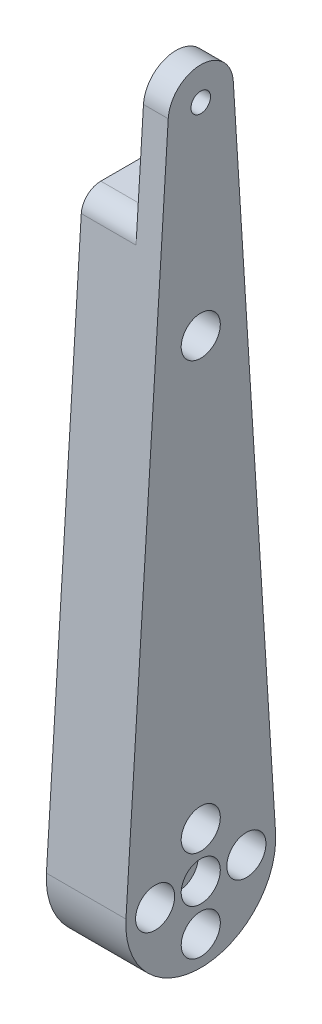
ISO-10303-21;
HEADER;
FILE_DESCRIPTION(('STEP AP214'),'2;1');
FILE_NAME('part.step','',(''),(''),'','','');
FILE_SCHEMA(('AUTOMOTIVE_DESIGN { 1 0 10303 214 1 1 1 1 }'));
ENDSEC;
DATA;
#1=APPLICATION_CONTEXT('core data for automotive mechanical design processes');
#2=APPLICATION_PROTOCOL_DEFINITION('international standard','automotive_design',2000,#1);
#3=PRODUCT_CONTEXT('',#1,'mechanical');
#4=PRODUCT('Part','Part','',(#3));
#5=PRODUCT_RELATED_PRODUCT_CATEGORY('part','',(#4));
#6=PRODUCT_DEFINITION_FORMATION('','',#4);
#7=PRODUCT_DEFINITION_CONTEXT('part definition',#1,'design');
#8=PRODUCT_DEFINITION('design','',#6,#7);
#9=PRODUCT_DEFINITION_SHAPE('','',#8);
#10=(LENGTH_UNIT() NAMED_UNIT(*) SI_UNIT(.MILLI.,.METRE.));
#11=(NAMED_UNIT(*) PLANE_ANGLE_UNIT() SI_UNIT($,.RADIAN.));
#12=(NAMED_UNIT(*) SI_UNIT($,.STERADIAN.) SOLID_ANGLE_UNIT());
#13=UNCERTAINTY_MEASURE_WITH_UNIT(LENGTH_MEASURE(1.E-05),#10,'distance_accuracy_value','');
#14=(GEOMETRIC_REPRESENTATION_CONTEXT(3) GLOBAL_UNCERTAINTY_ASSIGNED_CONTEXT((#13)) GLOBAL_UNIT_ASSIGNED_CONTEXT((#10,
#11,#12)) REPRESENTATION_CONTEXT('',''));
#15=CARTESIAN_POINT('',(0.,0.,0.));
#16=DIRECTION('',(0.,0.,1.));
#17=DIRECTION('',(1.,0.,0.));
#18=AXIS2_PLACEMENT_3D('',#15,#16,#17);
#19=CARTESIAN_POINT('',(3.80000000000004,0.,0.));
#20=DIRECTION('',(1.,0.,0.));
#21=DIRECTION('',(0.,1.,0.));
#22=AXIS2_PLACEMENT_3D('',#19,#20,#21);
#23=PLANE('',#22);
#24=CARTESIAN_POINT('',(3.8,72.5,0.));
#25=DIRECTION('',(1.,0.,0.));
#26=DIRECTION('',(0.,1.,0.));
#27=AXIS2_PLACEMENT_3D('',#24,#25,#26);
#28=CIRCLE('',#27,1.5);
#29=CARTESIAN_POINT('',(3.8,74.,0.));
#30=VERTEX_POINT('',#29);
#31=EDGE_CURVE('E37',#30,#30,#28,.T.);
#32=ORIENTED_EDGE('',*,*,#31,.T.);
#33=EDGE_LOOP('',(#32));
#34=FACE_BOUND('',#33,.T.);
#35=CARTESIAN_POINT('',(3.80000000000004,0.,0.));
#36=DIRECTION('',(1.,0.,0.));
#37=DIRECTION('',(0.,1.,0.));
#38=AXIS2_PLACEMENT_3D('',#35,#36,#37);
#39=CIRCLE('',#38,1.6);
#40=CARTESIAN_POINT('',(3.80000000000004,1.6,0.));
#41=VERTEX_POINT('',#40);
#42=EDGE_CURVE('E158',#41,#41,#39,.T.);
#43=ORIENTED_EDGE('',*,*,#42,.T.);
#44=EDGE_LOOP('',(#43));
#45=FACE_BOUND('',#44,.T.);
#46=CARTESIAN_POINT('',(3.80000000000004,0.,-7.));
#47=DIRECTION('',(1.,0.,0.));
#48=DIRECTION('',(0.,1.,0.));
#49=AXIS2_PLACEMENT_3D('',#46,#47,#48);
#50=CIRCLE('',#49,1.7);
#51=CARTESIAN_POINT('',(3.80000000000004,1.70000000000007,-7.));
#52=VERTEX_POINT('',#51);
#53=EDGE_CURVE('E173',#52,#52,#50,.F.);
#54=ORIENTED_EDGE('',*,*,#53,.F.);
#55=EDGE_LOOP('',(#54));
#56=FACE_BOUND('',#55,.T.);
#57=CARTESIAN_POINT('',(3.80000000000004,0.,7.));
#58=DIRECTION('',(1.,0.,0.));
#59=DIRECTION('',(0.,1.,0.));
#60=AXIS2_PLACEMENT_3D('',#57,#58,#59);
#61=CIRCLE('',#60,1.7);
#62=CARTESIAN_POINT('',(3.80000000000004,1.69999999999997,7.));
#63=VERTEX_POINT('',#62);
#64=EDGE_CURVE('E160',#63,#63,#61,.F.);
#65=ORIENTED_EDGE('',*,*,#64,.F.);
#66=EDGE_LOOP('',(#65));
#67=FACE_BOUND('',#66,.T.);
#68=CARTESIAN_POINT('',(3.80000000000004,0.,0.));
#69=DIRECTION('',(1.,0.,0.));
#70=DIRECTION('',(0.,1.,0.));
#71=AXIS2_PLACEMENT_3D('',#68,#69,#70);
#72=CIRCLE('',#71,11.5);
#73=CARTESIAN_POINT('',(3.80000000000004,0.722222222222222,11.4772991187704));
#74=VERTEX_POINT('',#73);
#75=CARTESIAN_POINT('',(3.80000000000002,0.722222222222222,-11.4772991187704));
#76=VERTEX_POINT('',#75);
#77=EDGE_CURVE('E163',#74,#76,#72,.T.);
#78=ORIENTED_EDGE('',*,*,#77,.F.);
#79=DIRECTION('',(0.,-0.998026010327863,0.0628019323671498));
#80=VECTOR('',#79,1.);
#81=CARTESIAN_POINT('',(3.80000000000004,0.722222222222215,11.4772991187704));
#82=LINE('',#81,#80);
#83=CARTESIAN_POINT('',(3.79999999999999,85.6884057971014,6.13070448181157));
#84=VERTEX_POINT('',#83);
#85=EDGE_CURVE('E161',#84,#74,#82,.T.);
#86=ORIENTED_EDGE('',*,*,#85,.F.);
#87=CARTESIAN_POINT('',(3.79999999999999,85.5,3.13662645082798));
#88=DIRECTION('',(-1.,0.,0.));
#89=DIRECTION('',(0.,-1.,0.));
#90=AXIS2_PLACEMENT_3D('',#87,#88,#89);
#91=CIRCLE('',#90,3.);
#92=CARTESIAN_POINT('',(3.79999999999999,88.5,3.13662645082798));
#93=VERTEX_POINT('',#92);
#94=EDGE_CURVE('E42',#84,#93,#91,.T.);
#95=ORIENTED_EDGE('',*,*,#94,.T.);
#96=DIRECTION('',(0.,0.,1.));
#97=VECTOR('',#96,1.);
#98=CARTESIAN_POINT('',(3.79999999999999,88.5,-11.5));
#99=LINE('',#98,#97);
#100=CARTESIAN_POINT('',(3.79999999999999,88.5,-3.13662645082798));
#101=VERTEX_POINT('',#100);
#102=EDGE_CURVE('E254',#101,#93,#99,.T.);
#103=ORIENTED_EDGE('',*,*,#102,.F.);
#104=CARTESIAN_POINT('',(3.79999999999999,85.5,-3.13662645082798));
#105=DIRECTION('',(-1.,0.,0.));
#106=DIRECTION('',(0.,-1.,0.));
#107=AXIS2_PLACEMENT_3D('',#104,#105,#106);
#108=CIRCLE('',#107,3.);
#109=CARTESIAN_POINT('',(3.79999999999999,85.6884057971015,-6.13070448181157));
#110=VERTEX_POINT('',#109);
#111=EDGE_CURVE('E11',#101,#110,#108,.T.);
#112=ORIENTED_EDGE('',*,*,#111,.T.);
#113=DIRECTION('',(0.,0.998026010327863,0.0628019323671498));
#114=VECTOR('',#113,1.);
#115=CARTESIAN_POINT('',(3.80000000000004,0.722222222222215,-11.4772991187704));
#116=LINE('',#115,#114);
#117=EDGE_CURVE('E50',#76,#110,#116,.T.);
#118=ORIENTED_EDGE('',*,*,#117,.F.);
#119=EDGE_LOOP('',(#78,#86,#95,#103,#112,#118));
#120=FACE_BOUND('',#119,.T.);
#121=CARTESIAN_POINT('',(3.80000000000005,-7.,0.));
#122=DIRECTION('',(1.,0.,0.));
#123=DIRECTION('',(0.,1.,0.));
#124=AXIS2_PLACEMENT_3D('',#121,#122,#123);
#125=CIRCLE('',#124,1.7);
#126=CARTESIAN_POINT('',(3.80000000000005,-5.3,0.));
#127=VERTEX_POINT('',#126);
#128=EDGE_CURVE('E170',#127,#127,#125,.F.);
#129=ORIENTED_EDGE('',*,*,#128,.F.);
#130=EDGE_LOOP('',(#129));
#131=FACE_BOUND('',#130,.T.);
#132=CARTESIAN_POINT('',(3.80000000000004,7.,0.));
#133=DIRECTION('',(1.,0.,0.));
#134=DIRECTION('',(0.,1.,0.));
#135=AXIS2_PLACEMENT_3D('',#132,#133,#134);
#136=CIRCLE('',#135,1.7);
#137=CARTESIAN_POINT('',(3.80000000000004,8.7,0.));
#138=VERTEX_POINT('',#137);
#139=EDGE_CURVE('E167',#138,#138,#136,.F.);
#140=ORIENTED_EDGE('',*,*,#139,.F.);
#141=EDGE_LOOP('',(#140));
#142=FACE_BOUND('',#141,.T.);
#143=ADVANCED_FACE('F34',(#34,#45,#56,#67,#120,#131,#142),#23,.F.);
#144=CARTESIAN_POINT('',(16.,7.,0.));
#145=DIRECTION('',(1.,0.,0.));
#146=DIRECTION('',(0.,0.,-1.));
#147=AXIS2_PLACEMENT_3D('',#144,#145,#146);
#148=CYLINDRICAL_SURFACE('',#147,3.);
#149=CARTESIAN_POINT('',(4.,7.,0.));
#150=DIRECTION('',(1.,0.,0.));
#151=DIRECTION('',(0.,0.,-1.));
#152=AXIS2_PLACEMENT_3D('',#149,#150,#151);
#153=CIRCLE('',#152,3.);
#154=CARTESIAN_POINT('',(4.,7.,-3.));
#155=VERTEX_POINT('',#154);
#156=EDGE_CURVE('E232',#155,#155,#153,.T.);
#157=ORIENTED_EDGE('',*,*,#156,.F.);
#158=EDGE_LOOP('',(#157));
#159=FACE_BOUND('',#158,.T.);
#160=CARTESIAN_POINT('',(16.,7.,0.));
#161=DIRECTION('',(1.,0.,0.));
#162=DIRECTION('',(0.,0.,-1.));
#163=AXIS2_PLACEMENT_3D('',#160,#161,#162);
#164=CIRCLE('',#163,3.);
#165=CARTESIAN_POINT('',(16.,7.,-3.));
#166=VERTEX_POINT('',#165);
#167=EDGE_CURVE('E213',#166,#166,#164,.T.);
#168=ORIENTED_EDGE('',*,*,#167,.T.);
#169=EDGE_LOOP('',(#168));
#170=FACE_BOUND('',#169,.T.);
#171=ADVANCED_FACE('F306',(#159,#170),#148,.F.);
#172=CARTESIAN_POINT('',(4.,8.7,0.));
#173=DIRECTION('',(-1.,0.,0.));
#174=DIRECTION('',(0.,0.,1.));
#175=AXIS2_PLACEMENT_3D('',#172,#173,#174);
#176=PLANE('',#175);
#177=CARTESIAN_POINT('',(4.,7.,0.));
#178=DIRECTION('',(1.,0.,0.));
#179=DIRECTION('',(0.,0.,-1.));
#180=AXIS2_PLACEMENT_3D('',#177,#178,#179);
#181=CIRCLE('',#180,1.7);
#182=CARTESIAN_POINT('',(4.,7.,-1.7));
#183=VERTEX_POINT('',#182);
#184=EDGE_CURVE('E235',#183,#183,#181,.T.);
#185=ORIENTED_EDGE('',*,*,#184,.F.);
#186=EDGE_LOOP('',(#185));
#187=FACE_BOUND('',#186,.T.);
#188=ORIENTED_EDGE('',*,*,#156,.T.);
#189=EDGE_LOOP('',(#188));
#190=FACE_BOUND('',#189,.T.);
#191=ADVANCED_FACE('F311',(#187,#190),#176,.F.);
#192=CARTESIAN_POINT('',(16.,7.,0.));
#193=DIRECTION('',(1.,0.,0.));
#194=DIRECTION('',(0.,0.,-1.));
#195=AXIS2_PLACEMENT_3D('',#192,#193,#194);
#196=CYLINDRICAL_SURFACE('',#195,1.7);
#197=ORIENTED_EDGE('',*,*,#139,.T.);
#198=EDGE_LOOP('',(#197));
#199=FACE_BOUND('',#198,.T.);
#200=ORIENTED_EDGE('',*,*,#184,.T.);
#201=EDGE_LOOP('',(#200));
#202=FACE_BOUND('',#201,.T.);
#203=ADVANCED_FACE('F363',(#199,#202),#196,.F.);
#204=CARTESIAN_POINT('',(16.,0.,-7.));
#205=DIRECTION('',(1.,0.,0.));
#206=DIRECTION('',(0.,-1.,0.));
#207=AXIS2_PLACEMENT_3D('',#204,#205,#206);
#208=CYLINDRICAL_SURFACE('',#207,3.);
#209=CARTESIAN_POINT('',(4.,0.,-7.));
#210=DIRECTION('',(1.,0.,0.));
#211=DIRECTION('',(0.,-1.,0.));
#212=AXIS2_PLACEMENT_3D('',#209,#210,#211);
#213=CIRCLE('',#212,3.);
#214=CARTESIAN_POINT('',(4.,-2.99999999999992,-7.00000000000003));
#215=VERTEX_POINT('',#214);
#216=EDGE_CURVE('E225',#215,#215,#213,.T.);
#217=ORIENTED_EDGE('',*,*,#216,.F.);
#218=EDGE_LOOP('',(#217));
#219=FACE_BOUND('',#218,.T.);
#220=CARTESIAN_POINT('',(16.,0.,-7.));
#221=DIRECTION('',(1.,0.,0.));
#222=DIRECTION('',(0.,-1.,0.));
#223=AXIS2_PLACEMENT_3D('',#220,#221,#222);
#224=CIRCLE('',#223,3.);
#225=CARTESIAN_POINT('',(16.,-2.99999999999992,-7.00000000000003));
#226=VERTEX_POINT('',#225);
#227=EDGE_CURVE('E140',#226,#226,#224,.T.);
#228=ORIENTED_EDGE('',*,*,#227,.T.);
#229=EDGE_LOOP('',(#228));
#230=FACE_BOUND('',#229,.T.);
#231=ADVANCED_FACE('F359',(#219,#230),#208,.F.);
#232=CARTESIAN_POINT('',(4.,0.,-8.7));
#233=DIRECTION('',(-1.,0.,0.));
#234=DIRECTION('',(0.,1.,0.));
#235=AXIS2_PLACEMENT_3D('',#232,#233,#234);
#236=PLANE('',#235);
#237=CARTESIAN_POINT('',(4.,0.,-7.));
#238=DIRECTION('',(1.,0.,0.));
#239=DIRECTION('',(0.,-1.,0.));
#240=AXIS2_PLACEMENT_3D('',#237,#238,#239);
#241=CIRCLE('',#240,1.7);
#242=CARTESIAN_POINT('',(4.,-1.69999999999992,-7.00000000000002));
#243=VERTEX_POINT('',#242);
#244=EDGE_CURVE('E218',#243,#243,#241,.T.);
#245=ORIENTED_EDGE('',*,*,#244,.F.);
#246=EDGE_LOOP('',(#245));
#247=FACE_BOUND('',#246,.T.);
#248=ORIENTED_EDGE('',*,*,#216,.T.);
#249=EDGE_LOOP('',(#248));
#250=FACE_BOUND('',#249,.T.);
#251=ADVANCED_FACE('F362',(#247,#250),#236,.F.);
#252=CARTESIAN_POINT('',(16.,0.,-7.));
#253=DIRECTION('',(1.,0.,0.));
#254=DIRECTION('',(0.,-1.,0.));
#255=AXIS2_PLACEMENT_3D('',#252,#253,#254);
#256=CYLINDRICAL_SURFACE('',#255,1.7);
#257=ORIENTED_EDGE('',*,*,#53,.T.);
#258=EDGE_LOOP('',(#257));
#259=FACE_BOUND('',#258,.T.);
#260=ORIENTED_EDGE('',*,*,#244,.T.);
#261=EDGE_LOOP('',(#260));
#262=FACE_BOUND('',#261,.T.);
#263=ADVANCED_FACE('F351',(#259,#262),#256,.F.);
#264=CARTESIAN_POINT('',(16.,-7.,0.));
#265=DIRECTION('',(1.,0.,0.));
#266=DIRECTION('',(0.,0.,1.));
#267=AXIS2_PLACEMENT_3D('',#264,#265,#266);
#268=CYLINDRICAL_SURFACE('',#267,3.);
#269=CARTESIAN_POINT('',(4.,-7.,0.));
#270=DIRECTION('',(1.,0.,0.));
#271=DIRECTION('',(0.,0.,1.));
#272=AXIS2_PLACEMENT_3D('',#269,#270,#271);
#273=CIRCLE('',#272,3.);
#274=CARTESIAN_POINT('',(4.,-7.,3.));
#275=VERTEX_POINT('',#274);
#276=EDGE_CURVE('E217',#275,#275,#273,.T.);
#277=ORIENTED_EDGE('',*,*,#276,.F.);
#278=EDGE_LOOP('',(#277));
#279=FACE_BOUND('',#278,.T.);
#280=CARTESIAN_POINT('',(16.,-7.,0.));
#281=DIRECTION('',(1.,0.,0.));
#282=DIRECTION('',(0.,0.,1.));
#283=AXIS2_PLACEMENT_3D('',#280,#281,#282);
#284=CIRCLE('',#283,3.);
#285=CARTESIAN_POINT('',(16.,-7.,3.));
#286=VERTEX_POINT('',#285);
#287=EDGE_CURVE('E214',#286,#286,#284,.T.);
#288=ORIENTED_EDGE('',*,*,#287,.T.);
#289=EDGE_LOOP('',(#288));
#290=FACE_BOUND('',#289,.T.);
#291=ADVANCED_FACE('F347',(#279,#290),#268,.F.);
#292=CARTESIAN_POINT('',(4.,-8.7,0.));
#293=DIRECTION('',(-1.,0.,0.));
#294=DIRECTION('',(0.,0.,-1.));
#295=AXIS2_PLACEMENT_3D('',#292,#293,#294);
#296=PLANE('',#295);
#297=CARTESIAN_POINT('',(4.,-7.,0.));
#298=DIRECTION('',(1.,0.,0.));
#299=DIRECTION('',(0.,0.,1.));
#300=AXIS2_PLACEMENT_3D('',#297,#298,#299);
#301=CIRCLE('',#300,1.7);
#302=CARTESIAN_POINT('',(4.,-7.,1.7));
#303=VERTEX_POINT('',#302);
#304=EDGE_CURVE('E207',#303,#303,#301,.T.);
#305=ORIENTED_EDGE('',*,*,#304,.F.);
#306=EDGE_LOOP('',(#305));
#307=FACE_BOUND('',#306,.T.);
#308=ORIENTED_EDGE('',*,*,#276,.T.);
#309=EDGE_LOOP('',(#308));
#310=FACE_BOUND('',#309,.T.);
#311=ADVANCED_FACE('F350',(#307,#310),#296,.F.);
#312=CARTESIAN_POINT('',(16.,-7.,0.));
#313=DIRECTION('',(1.,0.,0.));
#314=DIRECTION('',(0.,0.,1.));
#315=AXIS2_PLACEMENT_3D('',#312,#313,#314);
#316=CYLINDRICAL_SURFACE('',#315,1.7);
#317=ORIENTED_EDGE('',*,*,#128,.T.);
#318=EDGE_LOOP('',(#317));
#319=FACE_BOUND('',#318,.T.);
#320=ORIENTED_EDGE('',*,*,#304,.T.);
#321=EDGE_LOOP('',(#320));
#322=FACE_BOUND('',#321,.T.);
#323=ADVANCED_FACE('F339',(#319,#322),#316,.F.);
#324=CARTESIAN_POINT('',(16.,0.,7.));
#325=DIRECTION('',(1.,0.,0.));
#326=DIRECTION('',(0.,1.,0.));
#327=AXIS2_PLACEMENT_3D('',#324,#325,#326);
#328=CYLINDRICAL_SURFACE('',#327,3.);
#329=CARTESIAN_POINT('',(4.,0.,7.));
#330=DIRECTION('',(1.,0.,0.));
#331=DIRECTION('',(0.,1.,0.));
#332=AXIS2_PLACEMENT_3D('',#329,#330,#331);
#333=CIRCLE('',#332,3.);
#334=CARTESIAN_POINT('',(4.,2.99999999999997,7.00000000000001));
#335=VERTEX_POINT('',#334);
#336=EDGE_CURVE('E206',#335,#335,#333,.T.);
#337=ORIENTED_EDGE('',*,*,#336,.F.);
#338=EDGE_LOOP('',(#337));
#339=FACE_BOUND('',#338,.T.);
#340=CARTESIAN_POINT('',(16.,0.,7.));
#341=DIRECTION('',(1.,0.,0.));
#342=DIRECTION('',(0.,1.,0.));
#343=AXIS2_PLACEMENT_3D('',#340,#341,#342);
#344=CIRCLE('',#343,3.);
#345=CARTESIAN_POINT('',(16.,2.99999999999997,7.00000000000001));
#346=VERTEX_POINT('',#345);
#347=EDGE_CURVE('E203',#346,#346,#344,.T.);
#348=ORIENTED_EDGE('',*,*,#347,.T.);
#349=EDGE_LOOP('',(#348));
#350=FACE_BOUND('',#349,.T.);
#351=ADVANCED_FACE('F335',(#339,#350),#328,.F.);
#352=CARTESIAN_POINT('',(4.,0.,8.7));
#353=DIRECTION('',(-1.,0.,0.));
#354=DIRECTION('',(0.,-1.,0.));
#355=AXIS2_PLACEMENT_3D('',#352,#353,#354);
#356=PLANE('',#355);
#357=CARTESIAN_POINT('',(4.,0.,7.));
#358=DIRECTION('',(1.,0.,0.));
#359=DIRECTION('',(0.,1.,0.));
#360=AXIS2_PLACEMENT_3D('',#357,#358,#359);
#361=CIRCLE('',#360,1.7);
#362=CARTESIAN_POINT('',(4.,1.69999999999997,7.00000000000001));
#363=VERTEX_POINT('',#362);
#364=EDGE_CURVE('E210',#363,#363,#361,.T.);
#365=ORIENTED_EDGE('',*,*,#364,.F.);
#366=EDGE_LOOP('',(#365));
#367=FACE_BOUND('',#366,.T.);
#368=ORIENTED_EDGE('',*,*,#336,.T.);
#369=EDGE_LOOP('',(#368));
#370=FACE_BOUND('',#369,.T.);
#371=ADVANCED_FACE('F338',(#367,#370),#356,.F.);
#372=CARTESIAN_POINT('',(16.,0.,7.));
#373=DIRECTION('',(1.,0.,0.));
#374=DIRECTION('',(0.,1.,0.));
#375=AXIS2_PLACEMENT_3D('',#372,#373,#374);
#376=CYLINDRICAL_SURFACE('',#375,1.7);
#377=ORIENTED_EDGE('',*,*,#64,.T.);
#378=EDGE_LOOP('',(#377));
#379=FACE_BOUND('',#378,.T.);
#380=ORIENTED_EDGE('',*,*,#364,.T.);
#381=EDGE_LOOP('',(#380));
#382=FACE_BOUND('',#381,.T.);
#383=ADVANCED_FACE('F300',(#379,#382),#376,.F.);
#384=CARTESIAN_POINT('',(12.6,0.,0.));
#385=DIRECTION('',(1.,0.,0.));
#386=DIRECTION('',(0.,0.,-1.));
#387=AXIS2_PLACEMENT_3D('',#384,#385,#386);
#388=CYLINDRICAL_SURFACE('',#387,3.);
#389=CARTESIAN_POINT('',(12.6,0.,0.));
#390=DIRECTION('',(1.,0.,0.));
#391=DIRECTION('',(0.,0.,-1.));
#392=AXIS2_PLACEMENT_3D('',#389,#390,#391);
#393=CIRCLE('',#392,3.);
#394=CARTESIAN_POINT('',(12.6,0.,-3.));
#395=VERTEX_POINT('',#394);
#396=EDGE_CURVE('E141',#395,#395,#393,.T.);
#397=ORIENTED_EDGE('',*,*,#396,.F.);
#398=EDGE_LOOP('',(#397));
#399=FACE_BOUND('',#398,.T.);
#400=CARTESIAN_POINT('',(16.,0.,0.));
#401=DIRECTION('',(1.,0.,0.));
#402=DIRECTION('',(0.,0.,-1.));
#403=AXIS2_PLACEMENT_3D('',#400,#401,#402);
#404=CIRCLE('',#403,3.);
#405=CARTESIAN_POINT('',(16.,0.,-3.));
#406=VERTEX_POINT('',#405);
#407=EDGE_CURVE('E197',#406,#406,#404,.T.);
#408=ORIENTED_EDGE('',*,*,#407,.T.);
#409=EDGE_LOOP('',(#408));
#410=FACE_BOUND('',#409,.T.);
#411=ADVANCED_FACE('F294',(#399,#410),#388,.F.);
#412=CARTESIAN_POINT('',(16.,103.5,0.));
#413=DIRECTION('',(-1.,0.,0.));
#414=DIRECTION('',(0.,0.,1.));
#415=AXIS2_PLACEMENT_3D('',#412,#413,#414);
#416=CYLINDRICAL_SURFACE('',#415,1.5);
#417=CARTESIAN_POINT('',(12.2,103.5,0.));
#418=DIRECTION('',(1.,0.,0.));
#419=DIRECTION('',(0.,1.,0.));
#420=AXIS2_PLACEMENT_3D('',#417,#418,#419);
#421=CIRCLE('',#420,1.5);
#422=CARTESIAN_POINT('',(12.2,105.,0.));
#423=VERTEX_POINT('',#422);
#424=EDGE_CURVE('E119',#423,#423,#421,.T.);
#425=ORIENTED_EDGE('',*,*,#424,.F.);
#426=EDGE_LOOP('',(#425));
#427=FACE_BOUND('',#426,.T.);
#428=CARTESIAN_POINT('',(16.,103.5,0.));
#429=DIRECTION('',(1.,0.,0.));
#430=DIRECTION('',(0.,0.,-1.));
#431=AXIS2_PLACEMENT_3D('',#428,#429,#430);
#432=CIRCLE('',#431,1.5);
#433=CARTESIAN_POINT('',(16.,103.5,-1.5));
#434=VERTEX_POINT('',#433);
#435=EDGE_CURVE('E238',#434,#434,#432,.T.);
#436=ORIENTED_EDGE('',*,*,#435,.T.);
#437=EDGE_LOOP('',(#436));
#438=FACE_BOUND('',#437,.T.);
#439=ADVANCED_FACE('F279',(#427,#438),#416,.F.);
#440=CARTESIAN_POINT('',(16.,0.,0.));
#441=DIRECTION('',(1.,0.,0.));
#442=DIRECTION('',(0.,0.,-1.));
#443=AXIS2_PLACEMENT_3D('',#440,#441,#442);
#444=PLANE('',#443);
#445=CARTESIAN_POINT('',(16.,72.5,0.));
#446=DIRECTION('',(1.,0.,0.));
#447=DIRECTION('',(0.,0.,-1.));
#448=AXIS2_PLACEMENT_3D('',#445,#446,#447);
#449=CIRCLE('',#448,3.);
#450=CARTESIAN_POINT('',(16.,72.5,-3.));
#451=VERTEX_POINT('',#450);
#452=EDGE_CURVE('E271',#451,#451,#449,.T.);
#453=ORIENTED_EDGE('',*,*,#452,.F.);
#454=EDGE_LOOP('',(#453));
#455=FACE_BOUND('',#454,.T.);
#456=ORIENTED_EDGE('',*,*,#407,.F.);
#457=EDGE_LOOP('',(#456));
#458=FACE_BOUND('',#457,.T.);
#459=ORIENTED_EDGE('',*,*,#347,.F.);
#460=EDGE_LOOP('',(#459));
#461=FACE_BOUND('',#460,.T.);
#462=ORIENTED_EDGE('',*,*,#287,.F.);
#463=EDGE_LOOP('',(#462));
#464=FACE_BOUND('',#463,.T.);
#465=ORIENTED_EDGE('',*,*,#227,.F.);
#466=EDGE_LOOP('',(#465));
#467=FACE_BOUND('',#466,.T.);
#468=ORIENTED_EDGE('',*,*,#167,.F.);
#469=EDGE_LOOP('',(#468));
#470=FACE_BOUND('',#469,.T.);
#471=ORIENTED_EDGE('',*,*,#435,.F.);
#472=EDGE_LOOP('',(#471));
#473=FACE_BOUND('',#472,.T.);
#474=CARTESIAN_POINT('',(16.,103.5,0.));
#475=DIRECTION('',(1.,0.,0.));
#476=DIRECTION('',(0.,0.,-1.));
#477=AXIS2_PLACEMENT_3D('',#474,#475,#476);
#478=CIRCLE('',#477,5.);
#479=CARTESIAN_POINT('',(16.,103.814009661836,-4.99013005163932));
#480=VERTEX_POINT('',#479);
#481=CARTESIAN_POINT('',(16.,103.814009661836,4.99013005163932));
#482=VERTEX_POINT('',#481);
#483=EDGE_CURVE('E123',#480,#482,#478,.T.);
#484=ORIENTED_EDGE('',*,*,#483,.T.);
#485=DIRECTION('',(0.,-0.998026010327863,0.0628019323671498));
#486=VECTOR('',#485,1.);
#487=CARTESIAN_POINT('',(16.,0.722222222222222,11.4772991187704));
#488=LINE('',#487,#486);
#489=CARTESIAN_POINT('',(16.,0.722222222222222,11.4772991187704));
#490=VERTEX_POINT('',#489);
#491=EDGE_CURVE('E242',#482,#490,#488,.T.);
#492=ORIENTED_EDGE('',*,*,#491,.T.);
#493=CARTESIAN_POINT('',(16.,0.,0.));
#494=DIRECTION('',(1.,0.,0.));
#495=DIRECTION('',(0.,0.,-1.));
#496=AXIS2_PLACEMENT_3D('',#493,#494,#495);
#497=CIRCLE('',#496,11.5);
#498=CARTESIAN_POINT('',(16.,0.722222222222222,-11.4772991187704));
#499=VERTEX_POINT('',#498);
#500=EDGE_CURVE('E129',#490,#499,#497,.T.);
#501=ORIENTED_EDGE('',*,*,#500,.T.);
#502=DIRECTION('',(0.,0.998026010327863,0.0628019323671498));
#503=VECTOR('',#502,1.);
#504=CARTESIAN_POINT('',(16.,0.722222222222222,-11.4772991187704));
#505=LINE('',#504,#503);
#506=EDGE_CURVE('E125',#499,#480,#505,.T.);
#507=ORIENTED_EDGE('',*,*,#506,.T.);
#508=EDGE_LOOP('',(#484,#492,#501,#507));
#509=FACE_BOUND('',#508,.T.);
#510=ADVANCED_FACE('F246',(#455,#458,#461,#464,#467,#470,#473,#509),#444,.T.);
#511=CARTESIAN_POINT('',(16.,103.5,0.));
#512=DIRECTION('',(-1.,0.,0.));
#513=DIRECTION('',(0.,0.,1.));
#514=AXIS2_PLACEMENT_3D('',#511,#512,#513);
#515=CYLINDRICAL_SURFACE('',#514,5.);
#516=DIRECTION('',(-1.,0.,0.));
#517=VECTOR('',#516,1.);
#518=CARTESIAN_POINT('',(16.,103.814009661836,-4.99013005163932));
#519=LINE('',#518,#517);
#520=CARTESIAN_POINT('',(12.2,103.814009661836,-4.99013005163931));
#521=VERTEX_POINT('',#520);
#522=EDGE_CURVE('E115',#480,#521,#519,.T.);
#523=ORIENTED_EDGE('',*,*,#522,.T.);
#524=CARTESIAN_POINT('',(12.2,103.5,0.));
#525=DIRECTION('',(1.,0.,0.));
#526=DIRECTION('',(0.,1.,0.));
#527=AXIS2_PLACEMENT_3D('',#524,#525,#526);
#528=CIRCLE('',#527,5.);
#529=CARTESIAN_POINT('',(12.2,103.814009661836,4.99013005163932));
#530=VERTEX_POINT('',#529);
#531=EDGE_CURVE('E100',#521,#530,#528,.T.);
#532=ORIENTED_EDGE('',*,*,#531,.T.);
#533=DIRECTION('',(-1.,0.,0.));
#534=VECTOR('',#533,1.);
#535=CARTESIAN_POINT('',(16.,103.814009661836,4.99013005163932));
#536=LINE('',#535,#534);
#537=EDGE_CURVE('E135',#482,#530,#536,.T.);
#538=ORIENTED_EDGE('',*,*,#537,.F.);
#539=ORIENTED_EDGE('',*,*,#483,.F.);
#540=EDGE_LOOP('',(#523,#532,#538,#539));
#541=FACE_BOUND('',#540,.T.);
#542=ADVANCED_FACE('F121',(#541),#515,.T.);
#543=CARTESIAN_POINT('',(16.,0.,0.));
#544=DIRECTION('',(-1.,0.,0.));
#545=DIRECTION('',(0.,0.,1.));
#546=AXIS2_PLACEMENT_3D('',#543,#544,#545);
#547=CYLINDRICAL_SURFACE('',#546,11.5);
#548=DIRECTION('',(-1.,0.,0.));
#549=VECTOR('',#548,1.);
#550=CARTESIAN_POINT('',(16.,0.722222222222222,11.4772991187704));
#551=LINE('',#550,#549);
#552=EDGE_CURVE('E127',#490,#74,#551,.T.);
#553=ORIENTED_EDGE('',*,*,#552,.T.);
#554=ORIENTED_EDGE('',*,*,#77,.T.);
#555=DIRECTION('',(-1.,0.,0.));
#556=VECTOR('',#555,1.);
#557=CARTESIAN_POINT('',(16.,0.722222222222222,-11.4772991187704));
#558=LINE('',#557,#556);
#559=EDGE_CURVE('E124',#499,#76,#558,.T.);
#560=ORIENTED_EDGE('',*,*,#559,.F.);
#561=ORIENTED_EDGE('',*,*,#500,.F.);
#562=EDGE_LOOP('',(#553,#554,#560,#561));
#563=FACE_BOUND('',#562,.T.);
#564=ADVANCED_FACE('F249',(#563),#547,.T.);
#565=CARTESIAN_POINT('',(16.,0.722222222222222,-11.4772991187704));
#566=DIRECTION('',(0.,-0.0628019323671497,0.998026010327863));
#567=DIRECTION('',(0.,-0.998026010327863,-0.0628019323671498));
#568=AXIS2_PLACEMENT_3D('',#565,#566,#567);
#569=PLANE('',#568);
#570=ORIENTED_EDGE('',*,*,#559,.T.);
#571=ORIENTED_EDGE('',*,*,#117,.T.);
#572=DIRECTION('',(1.,0.,0.));
#573=VECTOR('',#572,1.);
#574=CARTESIAN_POINT('',(16.,85.6884057971015,-6.13070448181157));
#575=LINE('',#574,#573);
#576=CARTESIAN_POINT('',(12.2,85.6884057971014,-6.13070448181157));
#577=VERTEX_POINT('',#576);
#578=EDGE_CURVE('E118',#110,#577,#575,.T.);
#579=ORIENTED_EDGE('',*,*,#578,.T.);
#580=DIRECTION('',(0.,0.998026010327863,0.0628019323671498));
#581=VECTOR('',#580,1.);
#582=CARTESIAN_POINT('',(12.2,0.722222222222222,-11.4772991187704));
#583=LINE('',#582,#581);
#584=EDGE_CURVE('E103',#577,#521,#583,.T.);
#585=ORIENTED_EDGE('',*,*,#584,.T.);
#586=ORIENTED_EDGE('',*,*,#522,.F.);
#587=ORIENTED_EDGE('',*,*,#506,.F.);
#588=EDGE_LOOP('',(#570,#571,#579,#585,#586,#587));
#589=FACE_BOUND('',#588,.T.);
#590=ADVANCED_FACE('F113',(#589),#569,.F.);
#591=CARTESIAN_POINT('',(16.,0.722222222222222,11.4772991187704));
#592=DIRECTION('',(0.,-0.0628019323671498,-0.998026010327863));
#593=DIRECTION('',(0.,0.998026010327863,-0.0628019323671498));
#594=AXIS2_PLACEMENT_3D('',#591,#592,#593);
#595=PLANE('',#594);
#596=DIRECTION('',(-1.,0.,0.));
#597=VECTOR('',#596,1.);
#598=CARTESIAN_POINT('',(16.,85.6884057971015,6.13070448181157));
#599=LINE('',#598,#597);
#600=CARTESIAN_POINT('',(12.2,85.6884057971015,6.13070448181157));
#601=VERTEX_POINT('',#600);
#602=EDGE_CURVE('E151',#601,#84,#599,.T.);
#603=ORIENTED_EDGE('',*,*,#602,.T.);
#604=ORIENTED_EDGE('',*,*,#85,.T.);
#605=ORIENTED_EDGE('',*,*,#552,.F.);
#606=ORIENTED_EDGE('',*,*,#491,.F.);
#607=ORIENTED_EDGE('',*,*,#537,.T.);
#608=DIRECTION('',(0.,-0.998026010327863,0.0628019323671498));
#609=VECTOR('',#608,1.);
#610=CARTESIAN_POINT('',(12.2,0.722222222222222,11.4772991187704));
#611=LINE('',#610,#609);
#612=EDGE_CURVE('E106',#530,#601,#611,.T.);
#613=ORIENTED_EDGE('',*,*,#612,.T.);
#614=EDGE_LOOP('',(#603,#604,#605,#606,#607,#613));
#615=FACE_BOUND('',#614,.T.);
#616=ADVANCED_FACE('F333',(#615),#595,.F.);
#617=CARTESIAN_POINT('',(3.79999999999999,88.5,-11.5));
#618=DIRECTION('',(0.,-1.,0.));
#619=DIRECTION('',(0.,0.,-1.));
#620=AXIS2_PLACEMENT_3D('',#617,#618,#619);
#621=PLANE('',#620);
#622=DIRECTION('',(0.,0.,1.));
#623=VECTOR('',#622,1.);
#624=CARTESIAN_POINT('',(12.2,88.5,-11.5));
#625=LINE('',#624,#623);
#626=CARTESIAN_POINT('',(12.2,88.5,-3.13662645082798));
#627=VERTEX_POINT('',#626);
#628=CARTESIAN_POINT('',(12.2,88.5,3.13662645082798));
#629=VERTEX_POINT('',#628);
#630=EDGE_CURVE('E144',#627,#629,#625,.T.);
#631=ORIENTED_EDGE('',*,*,#630,.F.);
#632=DIRECTION('',(1.,0.,0.));
#633=VECTOR('',#632,1.);
#634=CARTESIAN_POINT('',(3.79999999999999,88.5,-3.13662645082798));
#635=LINE('',#634,#633);
#636=EDGE_CURVE('E148',#627,#101,#635,.F.);
#637=ORIENTED_EDGE('',*,*,#636,.T.);
#638=ORIENTED_EDGE('',*,*,#102,.T.);
#639=DIRECTION('',(-1.,0.,0.));
#640=VECTOR('',#639,1.);
#641=CARTESIAN_POINT('',(3.79999999999999,88.5,3.13662645082798));
#642=LINE('',#641,#640);
#643=EDGE_CURVE('E146',#93,#629,#642,.F.);
#644=ORIENTED_EDGE('',*,*,#643,.T.);
#645=EDGE_LOOP('',(#631,#637,#638,#644));
#646=FACE_BOUND('',#645,.T.);
#647=ADVANCED_FACE('F261',(#646),#621,.F.);
#648=CARTESIAN_POINT('',(12.2,108.5,-11.5));
#649=DIRECTION('',(1.,0.,0.));
#650=DIRECTION('',(0.,1.,0.));
#651=AXIS2_PLACEMENT_3D('',#648,#649,#650);
#652=PLANE('',#651);
#653=ORIENTED_EDGE('',*,*,#424,.T.);
#654=EDGE_LOOP('',(#653));
#655=FACE_BOUND('',#654,.T.);
#656=ORIENTED_EDGE('',*,*,#531,.F.);
#657=ORIENTED_EDGE('',*,*,#584,.F.);
#658=CARTESIAN_POINT('',(12.2,85.5,-3.13662645082798));
#659=DIRECTION('',(1.,0.,0.));
#660=DIRECTION('',(0.,1.,0.));
#661=AXIS2_PLACEMENT_3D('',#658,#659,#660);
#662=CIRCLE('',#661,3.);
#663=EDGE_CURVE('E154',#577,#627,#662,.T.);
#664=ORIENTED_EDGE('',*,*,#663,.T.);
#665=ORIENTED_EDGE('',*,*,#630,.T.);
#666=CARTESIAN_POINT('',(12.2,85.5,3.13662645082798));
#667=DIRECTION('',(1.,0.,0.));
#668=DIRECTION('',(0.,1.,0.));
#669=AXIS2_PLACEMENT_3D('',#666,#667,#668);
#670=CIRCLE('',#669,3.);
#671=EDGE_CURVE('E155',#629,#601,#670,.T.);
#672=ORIENTED_EDGE('',*,*,#671,.T.);
#673=ORIENTED_EDGE('',*,*,#612,.F.);
#674=EDGE_LOOP('',(#656,#657,#664,#665,#672,#673));
#675=FACE_BOUND('',#674,.T.);
#676=ADVANCED_FACE('F102',(#655,#675),#652,.F.);
#677=CARTESIAN_POINT('',(16.,85.5,3.13662645082798));
#678=DIRECTION('',(-1.,0.,0.));
#679=DIRECTION('',(0.,0.,1.));
#680=AXIS2_PLACEMENT_3D('',#677,#678,#679);
#681=CYLINDRICAL_SURFACE('',#680,3.);
#682=ORIENTED_EDGE('',*,*,#671,.F.);
#683=ORIENTED_EDGE('',*,*,#643,.F.);
#684=ORIENTED_EDGE('',*,*,#94,.F.);
#685=ORIENTED_EDGE('',*,*,#602,.F.);
#686=EDGE_LOOP('',(#682,#683,#684,#685));
#687=FACE_BOUND('',#686,.T.);
#688=ADVANCED_FACE('F330',(#687),#681,.T.);
#689=CARTESIAN_POINT('',(16.,85.5,-3.13662645082798));
#690=DIRECTION('',(1.,0.,0.));
#691=DIRECTION('',(0.,0.,-1.));
#692=AXIS2_PLACEMENT_3D('',#689,#690,#691);
#693=CYLINDRICAL_SURFACE('',#692,3.);
#694=ORIENTED_EDGE('',*,*,#111,.F.);
#695=ORIENTED_EDGE('',*,*,#636,.F.);
#696=ORIENTED_EDGE('',*,*,#663,.F.);
#697=ORIENTED_EDGE('',*,*,#578,.F.);
#698=EDGE_LOOP('',(#694,#695,#696,#697));
#699=FACE_BOUND('',#698,.T.);
#700=ADVANCED_FACE('F192',(#699),#693,.T.);
#701=CARTESIAN_POINT('',(12.6,0.,0.));
#702=DIRECTION('',(1.,0.,0.));
#703=DIRECTION('',(0.,0.,-1.));
#704=AXIS2_PLACEMENT_3D('',#701,#702,#703);
#705=PLANE('',#704);
#706=CARTESIAN_POINT('',(12.6,0.,0.));
#707=DIRECTION('',(1.,0.,0.));
#708=DIRECTION('',(0.,0.,-1.));
#709=AXIS2_PLACEMENT_3D('',#706,#707,#708);
#710=CIRCLE('',#709,1.6);
#711=CARTESIAN_POINT('',(12.6,0.,-1.6));
#712=VERTEX_POINT('',#711);
#713=EDGE_CURVE('E137',#712,#712,#710,.T.);
#714=ORIENTED_EDGE('',*,*,#713,.F.);
#715=EDGE_LOOP('',(#714));
#716=FACE_BOUND('',#715,.T.);
#717=ORIENTED_EDGE('',*,*,#396,.T.);
#718=EDGE_LOOP('',(#717));
#719=FACE_BOUND('',#718,.T.);
#720=ADVANCED_FACE('F186',(#716,#719),#705,.T.);
#721=CARTESIAN_POINT('',(16.,0.,0.));
#722=DIRECTION('',(-1.,0.,0.));
#723=DIRECTION('',(0.,0.,1.));
#724=AXIS2_PLACEMENT_3D('',#721,#722,#723);
#725=CYLINDRICAL_SURFACE('',#724,1.6);
#726=ORIENTED_EDGE('',*,*,#42,.F.);
#727=EDGE_LOOP('',(#726));
#728=FACE_BOUND('',#727,.T.);
#729=ORIENTED_EDGE('',*,*,#713,.T.);
#730=EDGE_LOOP('',(#729));
#731=FACE_BOUND('',#730,.T.);
#732=ADVANCED_FACE('F182',(#728,#731),#725,.F.);
#733=CARTESIAN_POINT('',(16.,72.5,0.));
#734=DIRECTION('',(1.,0.,0.));
#735=DIRECTION('',(0.,0.,-1.));
#736=AXIS2_PLACEMENT_3D('',#733,#734,#735);
#737=CYLINDRICAL_SURFACE('',#736,1.5);
#738=CARTESIAN_POINT('',(8.,72.5,0.));
#739=DIRECTION('',(1.,0.,0.));
#740=DIRECTION('',(0.,0.,-1.));
#741=AXIS2_PLACEMENT_3D('',#738,#739,#740);
#742=CIRCLE('',#741,1.5);
#743=CARTESIAN_POINT('',(8.,72.5,-1.5));
#744=VERTEX_POINT('',#743);
#745=EDGE_CURVE('E265',#744,#744,#742,.T.);
#746=ORIENTED_EDGE('',*,*,#745,.T.);
#747=EDGE_LOOP('',(#746));
#748=FACE_BOUND('',#747,.T.);
#749=ORIENTED_EDGE('',*,*,#31,.F.);
#750=EDGE_LOOP('',(#749));
#751=FACE_BOUND('',#750,.T.);
#752=ADVANCED_FACE('F185',(#748,#751),#737,.F.);
#753=CARTESIAN_POINT('',(8.,74.,0.));
#754=DIRECTION('',(-1.,0.,0.));
#755=DIRECTION('',(0.,0.,1.));
#756=AXIS2_PLACEMENT_3D('',#753,#754,#755);
#757=PLANE('',#756);
#758=ORIENTED_EDGE('',*,*,#745,.F.);
#759=EDGE_LOOP('',(#758));
#760=FACE_BOUND('',#759,.T.);
#761=CARTESIAN_POINT('',(8.,72.5,0.));
#762=DIRECTION('',(1.,0.,0.));
#763=DIRECTION('',(0.,0.,-1.));
#764=AXIS2_PLACEMENT_3D('',#761,#762,#763);
#765=CIRCLE('',#764,3.);
#766=CARTESIAN_POINT('',(8.,72.5,-3.));
#767=VERTEX_POINT('',#766);
#768=EDGE_CURVE('E268',#767,#767,#765,.T.);
#769=ORIENTED_EDGE('',*,*,#768,.T.);
#770=EDGE_LOOP('',(#769));
#771=FACE_BOUND('',#770,.T.);
#772=ADVANCED_FACE('F318',(#760,#771),#757,.F.);
#773=CARTESIAN_POINT('',(16.,72.5,0.));
#774=DIRECTION('',(1.,0.,0.));
#775=DIRECTION('',(0.,0.,-1.));
#776=AXIS2_PLACEMENT_3D('',#773,#774,#775);
#777=CYLINDRICAL_SURFACE('',#776,3.);
#778=ORIENTED_EDGE('',*,*,#768,.F.);
#779=EDGE_LOOP('',(#778));
#780=FACE_BOUND('',#779,.T.);
#781=ORIENTED_EDGE('',*,*,#452,.T.);
#782=EDGE_LOOP('',(#781));
#783=FACE_BOUND('',#782,.T.);
#784=ADVANCED_FACE('F275',(#780,#783),#777,.F.);
#785=CLOSED_SHELL('',(#143,#171,#191,#203,#231,#251,#263,#291,#311,#323,#351,#371,#383,#411,
#439,#510,#542,#564,#590,#616,#647,#676,#688,#700,#720,#732,#752,#772,#784));
#786=MANIFOLD_SOLID_BREP('B2',#785);
#787=ADVANCED_BREP_SHAPE_REPRESENTATION('',(#18,#786),#14);
#788=SHAPE_DEFINITION_REPRESENTATION(#9,#787);
ENDSEC;
END-ISO-10303-21;
